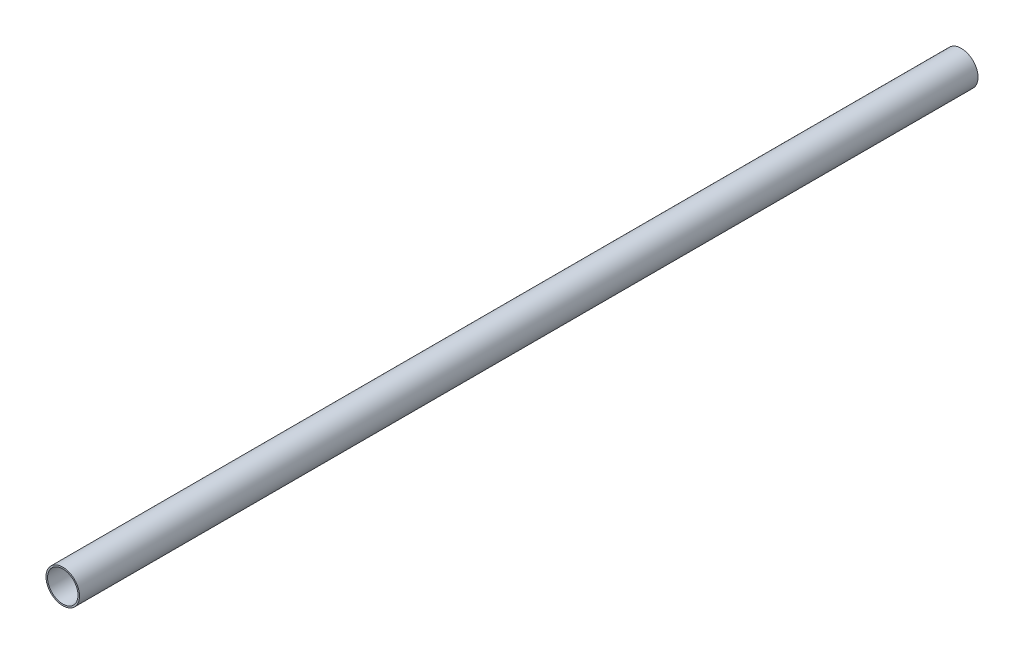
ISO-10303-21;
HEADER;
FILE_DESCRIPTION(('STEP AP214'),'2;1');
FILE_NAME('part.step','',(''),(''),'','','');
FILE_SCHEMA(('AUTOMOTIVE_DESIGN { 1 0 10303 214 1 1 1 1 }'));
ENDSEC;
DATA;
#1=APPLICATION_CONTEXT('core data for automotive mechanical design processes');
#2=APPLICATION_PROTOCOL_DEFINITION('international standard','automotive_design',2000,#1);
#3=PRODUCT_CONTEXT('',#1,'mechanical');
#4=PRODUCT('Part','Part','',(#3));
#5=PRODUCT_RELATED_PRODUCT_CATEGORY('part','',(#4));
#6=PRODUCT_DEFINITION_FORMATION('','',#4);
#7=PRODUCT_DEFINITION_CONTEXT('part definition',#1,'design');
#8=PRODUCT_DEFINITION('design','',#6,#7);
#9=PRODUCT_DEFINITION_SHAPE('','',#8);
#10=(LENGTH_UNIT() NAMED_UNIT(*) SI_UNIT(.MILLI.,.METRE.));
#11=(NAMED_UNIT(*) PLANE_ANGLE_UNIT() SI_UNIT($,.RADIAN.));
#12=(NAMED_UNIT(*) SI_UNIT($,.STERADIAN.) SOLID_ANGLE_UNIT());
#13=UNCERTAINTY_MEASURE_WITH_UNIT(LENGTH_MEASURE(1.E-05),#10,'distance_accuracy_value','');
#14=(GEOMETRIC_REPRESENTATION_CONTEXT(3) GLOBAL_UNCERTAINTY_ASSIGNED_CONTEXT((#13)) GLOBAL_UNIT_ASSIGNED_CONTEXT((#10,
#11,#12)) REPRESENTATION_CONTEXT('',''));
#15=CARTESIAN_POINT('',(0.,0.,0.));
#16=DIRECTION('',(0.,0.,1.));
#17=DIRECTION('',(1.,0.,0.));
#18=AXIS2_PLACEMENT_3D('',#15,#16,#17);
#19=CARTESIAN_POINT('',(0.,0.,1498.6));
#20=DIRECTION('',(0.,0.,1.));
#21=DIRECTION('',(1.,0.,0.));
#22=AXIS2_PLACEMENT_3D('',#19,#20,#21);
#23=PLANE('',#22);
#24=CARTESIAN_POINT('',(0.,0.,1498.6));
#25=DIRECTION('',(0.,0.,1.));
#26=DIRECTION('',(1.,0.,0.));
#27=AXIS2_PLACEMENT_3D('',#24,#25,#26);
#28=CIRCLE('',#27,27.94);
#29=CARTESIAN_POINT('',(-27.94,0.,1498.6));
#30=VERTEX_POINT('',#29);
#31=EDGE_CURVE('E10',#30,#30,#28,.T.);
#32=ORIENTED_EDGE('',*,*,#31,.T.);
#33=EDGE_LOOP('',(#32));
#34=FACE_BOUND('',#33,.T.);
#35=CARTESIAN_POINT('',(0.,0.,1498.6));
#36=DIRECTION('',(0.,0.,1.));
#37=DIRECTION('',(1.,0.,0.));
#38=AXIS2_PLACEMENT_3D('',#35,#36,#37);
#39=CIRCLE('',#38,25.4);
#40=CARTESIAN_POINT('',(-25.4,0.,1498.6));
#41=VERTEX_POINT('',#40);
#42=EDGE_CURVE('E43',#41,#41,#39,.T.);
#43=ORIENTED_EDGE('',*,*,#42,.F.);
#44=EDGE_LOOP('',(#43));
#45=FACE_BOUND('',#44,.T.);
#46=ADVANCED_FACE('F32',(#34,#45),#23,.T.);
#47=CARTESIAN_POINT('',(0.,0.,0.));
#48=DIRECTION('',(0.,0.,1.));
#49=DIRECTION('',(1.,0.,0.));
#50=AXIS2_PLACEMENT_3D('',#47,#48,#49);
#51=PLANE('',#50);
#52=CARTESIAN_POINT('',(0.,0.,0.));
#53=DIRECTION('',(0.,0.,1.));
#54=DIRECTION('',(1.,0.,0.));
#55=AXIS2_PLACEMENT_3D('',#52,#53,#54);
#56=CIRCLE('',#55,27.94);
#57=CARTESIAN_POINT('',(-27.94,0.,0.));
#58=VERTEX_POINT('',#57);
#59=EDGE_CURVE('E36',#58,#58,#56,.T.);
#60=ORIENTED_EDGE('',*,*,#59,.F.);
#61=EDGE_LOOP('',(#60));
#62=FACE_BOUND('',#61,.T.);
#63=CARTESIAN_POINT('',(0.,0.,0.));
#64=DIRECTION('',(0.,0.,1.));
#65=DIRECTION('',(1.,0.,0.));
#66=AXIS2_PLACEMENT_3D('',#63,#64,#65);
#67=CIRCLE('',#66,25.4);
#68=CARTESIAN_POINT('',(-25.4,0.,0.));
#69=VERTEX_POINT('',#68);
#70=EDGE_CURVE('E45',#69,#69,#67,.T.);
#71=ORIENTED_EDGE('',*,*,#70,.T.);
#72=EDGE_LOOP('',(#71));
#73=FACE_BOUND('',#72,.T.);
#74=ADVANCED_FACE('F55',(#62,#73),#51,.F.);
#75=CARTESIAN_POINT('',(0.,0.,1498.6));
#76=DIRECTION('',(0.,0.,-1.));
#77=DIRECTION('',(-1.,0.,0.));
#78=AXIS2_PLACEMENT_3D('',#75,#76,#77);
#79=CYLINDRICAL_SURFACE('',#78,27.94);
#80=CARTESIAN_POINT('',(-27.94,0.,1498.6));
#81=CARTESIAN_POINT('',(-27.94,0.,1482.98958333333));
#82=CARTESIAN_POINT('',(-27.94,0.,1467.37916666667));
#83=CARTESIAN_POINT('',(-27.94,0.,1436.15833333333));
#84=CARTESIAN_POINT('',(-27.94,0.,1420.54791666667));
#85=CARTESIAN_POINT('',(-27.94,0.,1389.32708333333));
#86=CARTESIAN_POINT('',(-27.94,0.,1373.71666666667));
#87=CARTESIAN_POINT('',(-27.94,0.,1342.49583333333));
#88=CARTESIAN_POINT('',(-27.94,0.,1326.88541666667));
#89=CARTESIAN_POINT('',(-27.94,0.,1295.66458333333));
#90=CARTESIAN_POINT('',(-27.94,0.,1280.05416666667));
#91=CARTESIAN_POINT('',(-27.94,0.,1248.83333333333));
#92=CARTESIAN_POINT('',(-27.94,0.,1233.22291666667));
#93=CARTESIAN_POINT('',(-27.94,0.,1202.00208333333));
#94=CARTESIAN_POINT('',(-27.94,0.,1186.39166666667));
#95=CARTESIAN_POINT('',(-27.94,0.,1155.17083333333));
#96=CARTESIAN_POINT('',(-27.94,0.,1139.56041666667));
#97=CARTESIAN_POINT('',(-27.94,0.,1108.33958333333));
#98=CARTESIAN_POINT('',(-27.94,0.,1092.72916666667));
#99=CARTESIAN_POINT('',(-27.94,0.,1061.50833333333));
#100=CARTESIAN_POINT('',(-27.94,0.,1045.89791666667));
#101=CARTESIAN_POINT('',(-27.94,0.,1014.67708333333));
#102=CARTESIAN_POINT('',(-27.94,0.,999.066666666666));
#103=CARTESIAN_POINT('',(-27.94,0.,967.845833333333));
#104=CARTESIAN_POINT('',(-27.94,0.,952.235416666667));
#105=CARTESIAN_POINT('',(-27.94,0.,921.014583333333));
#106=CARTESIAN_POINT('',(-27.94,0.,905.404166666666));
#107=CARTESIAN_POINT('',(-27.94,0.,874.183333333333));
#108=CARTESIAN_POINT('',(-27.94,0.,858.572916666667));
#109=CARTESIAN_POINT('',(-27.94,0.,827.352083333333));
#110=CARTESIAN_POINT('',(-27.94,0.,811.741666666666));
#111=CARTESIAN_POINT('',(-27.94,0.,780.520833333333));
#112=CARTESIAN_POINT('',(-27.94,0.,764.910416666666));
#113=CARTESIAN_POINT('',(-27.94,0.,733.689583333333));
#114=CARTESIAN_POINT('',(-27.94,0.,718.079166666667));
#115=CARTESIAN_POINT('',(-27.94,0.,686.858333333333));
#116=CARTESIAN_POINT('',(-27.94,0.,671.247916666666));
#117=CARTESIAN_POINT('',(-27.94,0.,640.027083333333));
#118=CARTESIAN_POINT('',(-27.94,0.,624.416666666667));
#119=CARTESIAN_POINT('',(-27.94,0.,593.195833333333));
#120=CARTESIAN_POINT('',(-27.94,0.,577.585416666667));
#121=CARTESIAN_POINT('',(-27.94,0.,546.364583333333));
#122=CARTESIAN_POINT('',(-27.94,0.,530.754166666666));
#123=CARTESIAN_POINT('',(-27.94,0.,499.533333333333));
#124=CARTESIAN_POINT('',(-27.94,0.,483.922916666667));
#125=CARTESIAN_POINT('',(-27.94,0.,452.702083333333));
#126=CARTESIAN_POINT('',(-27.94,0.,437.091666666667));
#127=CARTESIAN_POINT('',(-27.94,0.,405.870833333333));
#128=CARTESIAN_POINT('',(-27.94,0.,390.260416666667));
#129=CARTESIAN_POINT('',(-27.94,0.,359.039583333333));
#130=CARTESIAN_POINT('',(-27.94,0.,343.429166666667));
#131=CARTESIAN_POINT('',(-27.94,0.,312.208333333333));
#132=CARTESIAN_POINT('',(-27.94,0.,296.597916666667));
#133=CARTESIAN_POINT('',(-27.94,0.,265.377083333333));
#134=CARTESIAN_POINT('',(-27.94,0.,249.766666666667));
#135=CARTESIAN_POINT('',(-27.94,0.,218.545833333333));
#136=CARTESIAN_POINT('',(-27.94,0.,202.935416666667));
#137=CARTESIAN_POINT('',(-27.94,0.,171.714583333333));
#138=CARTESIAN_POINT('',(-27.94,0.,156.104166666667));
#139=CARTESIAN_POINT('',(-27.94,0.,124.883333333333));
#140=CARTESIAN_POINT('',(-27.94,0.,109.272916666667));
#141=CARTESIAN_POINT('',(-27.94,0.,78.0520833333334));
#142=CARTESIAN_POINT('',(-27.94,0.,62.4416666666667));
#143=CARTESIAN_POINT('',(-27.94,0.,31.2208333333334));
#144=CARTESIAN_POINT('',(-27.94,0.,15.6104166666667));
#145=CARTESIAN_POINT('',(-27.94,0.,0.));
#146=B_SPLINE_CURVE_WITH_KNOTS('',3,(#80,#81,#82,#83,#84,#85,#86,#87,#88,#89,#90,#91,#92,#93,
#94,#95,#96,#97,#98,#99,#100,#101,#102,#103,#104,#105,#106,#107,#108,#109,#110,#111,#112,#113,
#114,#115,#116,#117,#118,#119,#120,#121,#122,#123,#124,#125,#126,#127,#128,#129,#130,#131,#132,
#133,#134,#135,#136,#137,#138,#139,#140,#141,#142,#143,#144,#145),.UNSPECIFIED.,.F.,.F.,(4,2,2,
2,2,2,2,2,2,2,2,2,2,2,2,2,2,2,2,2,2,2,2,2,2,2,2,2,2,2,2,2,4),(0.,46.8312500000001,
93.6625000000002,140.49375,187.325,234.15625,280.9875,327.81875,374.65,421.48125,468.3125,
515.14375,561.975,608.80625,655.6375,702.46875,749.3,796.13125,842.9625,889.79375,936.625,
983.45625,1030.2875,1077.11875,1123.95,1170.78125,1217.6125,1264.44375,1311.275,1358.10625,
1404.9375,1451.76875,1498.6),.UNSPECIFIED.);
#147=EDGE_CURVE('BSEAM34',#30,#58,#146,.T.);
#148=ORIENTED_EDGE('',*,*,#31,.F.);
#149=ORIENTED_EDGE('',*,*,#59,.T.);
#150=ORIENTED_EDGE('',*,*,#147,.T.);
#151=ORIENTED_EDGE('',*,*,#147,.F.);
#152=EDGE_LOOP('',(#148,#150,#149,#151));
#153=FACE_BOUND('',#152,.T.);
#154=ADVANCED_FACE('F34',(#153),#79,.T.);
#155=CARTESIAN_POINT('',(0.,0.,1498.6));
#156=DIRECTION('',(0.,0.,-1.));
#157=DIRECTION('',(-1.,0.,0.));
#158=AXIS2_PLACEMENT_3D('',#155,#156,#157);
#159=CYLINDRICAL_SURFACE('',#158,25.4);
#160=CARTESIAN_POINT('',(-25.4,0.,1498.6));
#161=CARTESIAN_POINT('',(-25.4,0.,1482.98958333333));
#162=CARTESIAN_POINT('',(-25.4,0.,1467.37916666667));
#163=CARTESIAN_POINT('',(-25.4,0.,1436.15833333333));
#164=CARTESIAN_POINT('',(-25.4,0.,1420.54791666667));
#165=CARTESIAN_POINT('',(-25.4,0.,1389.32708333333));
#166=CARTESIAN_POINT('',(-25.4,0.,1373.71666666667));
#167=CARTESIAN_POINT('',(-25.4,0.,1342.49583333333));
#168=CARTESIAN_POINT('',(-25.4,0.,1326.88541666667));
#169=CARTESIAN_POINT('',(-25.4,0.,1295.66458333333));
#170=CARTESIAN_POINT('',(-25.4,0.,1280.05416666667));
#171=CARTESIAN_POINT('',(-25.4,0.,1248.83333333333));
#172=CARTESIAN_POINT('',(-25.4,0.,1233.22291666667));
#173=CARTESIAN_POINT('',(-25.4,0.,1202.00208333333));
#174=CARTESIAN_POINT('',(-25.4,0.,1186.39166666667));
#175=CARTESIAN_POINT('',(-25.4,0.,1155.17083333333));
#176=CARTESIAN_POINT('',(-25.4,0.,1139.56041666667));
#177=CARTESIAN_POINT('',(-25.4,0.,1108.33958333333));
#178=CARTESIAN_POINT('',(-25.4,0.,1092.72916666667));
#179=CARTESIAN_POINT('',(-25.4,0.,1061.50833333333));
#180=CARTESIAN_POINT('',(-25.4,0.,1045.89791666667));
#181=CARTESIAN_POINT('',(-25.4,0.,1014.67708333333));
#182=CARTESIAN_POINT('',(-25.4,0.,999.066666666667));
#183=CARTESIAN_POINT('',(-25.4,0.,967.845833333333));
#184=CARTESIAN_POINT('',(-25.4,0.,952.235416666667));
#185=CARTESIAN_POINT('',(-25.4,0.,921.014583333333));
#186=CARTESIAN_POINT('',(-25.4,0.,905.404166666667));
#187=CARTESIAN_POINT('',(-25.4,0.,874.183333333333));
#188=CARTESIAN_POINT('',(-25.4,0.,858.572916666667));
#189=CARTESIAN_POINT('',(-25.4,0.,827.352083333333));
#190=CARTESIAN_POINT('',(-25.4,0.,811.741666666667));
#191=CARTESIAN_POINT('',(-25.4,0.,780.520833333333));
#192=CARTESIAN_POINT('',(-25.4,0.,764.910416666667));
#193=CARTESIAN_POINT('',(-25.4,0.,733.689583333333));
#194=CARTESIAN_POINT('',(-25.4,0.,718.079166666667));
#195=CARTESIAN_POINT('',(-25.4,0.,686.858333333333));
#196=CARTESIAN_POINT('',(-25.4,0.,671.247916666667));
#197=CARTESIAN_POINT('',(-25.4,0.,640.027083333333));
#198=CARTESIAN_POINT('',(-25.4,0.,624.416666666667));
#199=CARTESIAN_POINT('',(-25.4,0.,593.195833333333));
#200=CARTESIAN_POINT('',(-25.4,0.,577.585416666667));
#201=CARTESIAN_POINT('',(-25.4,0.,546.364583333333));
#202=CARTESIAN_POINT('',(-25.4,0.,530.754166666667));
#203=CARTESIAN_POINT('',(-25.4,0.,499.533333333333));
#204=CARTESIAN_POINT('',(-25.4,0.,483.922916666667));
#205=CARTESIAN_POINT('',(-25.4,0.,452.702083333333));
#206=CARTESIAN_POINT('',(-25.4,0.,437.091666666667));
#207=CARTESIAN_POINT('',(-25.4,0.,405.870833333333));
#208=CARTESIAN_POINT('',(-25.4,0.,390.260416666667));
#209=CARTESIAN_POINT('',(-25.4,0.,359.039583333333));
#210=CARTESIAN_POINT('',(-25.4,0.,343.429166666667));
#211=CARTESIAN_POINT('',(-25.4,0.,312.208333333333));
#212=CARTESIAN_POINT('',(-25.4,0.,296.597916666667));
#213=CARTESIAN_POINT('',(-25.4,0.,265.377083333333));
#214=CARTESIAN_POINT('',(-25.4,0.,249.766666666667));
#215=CARTESIAN_POINT('',(-25.4,0.,218.545833333333));
#216=CARTESIAN_POINT('',(-25.4,0.,202.935416666667));
#217=CARTESIAN_POINT('',(-25.4,0.,171.714583333333));
#218=CARTESIAN_POINT('',(-25.4,0.,156.104166666667));
#219=CARTESIAN_POINT('',(-25.4,0.,124.883333333333));
#220=CARTESIAN_POINT('',(-25.4,0.,109.272916666667));
#221=CARTESIAN_POINT('',(-25.4,0.,78.0520833333334));
#222=CARTESIAN_POINT('',(-25.4,0.,62.4416666666667));
#223=CARTESIAN_POINT('',(-25.4,0.,31.2208333333334));
#224=CARTESIAN_POINT('',(-25.4,0.,15.6104166666667));
#225=CARTESIAN_POINT('',(-25.4,0.,0.));
#226=B_SPLINE_CURVE_WITH_KNOTS('',3,(#160,#161,#162,#163,#164,#165,#166,#167,#168,#169,#170,
#171,#172,#173,#174,#175,#176,#177,#178,#179,#180,#181,#182,#183,#184,#185,#186,#187,#188,#189,
#190,#191,#192,#193,#194,#195,#196,#197,#198,#199,#200,#201,#202,#203,#204,#205,#206,#207,#208,
#209,#210,#211,#212,#213,#214,#215,#216,#217,#218,#219,#220,#221,#222,#223,#224,#225),
.UNSPECIFIED.,.F.,.F.,(4,2,2,2,2,2,2,2,2,2,2,2,2,2,2,2,2,2,2,2,2,2,2,2,2,2,2,2,2,2,2,2,4),(0.,
46.8312499999999,93.6624999999998,140.49375,187.325,234.15625,280.9875,327.81875,374.65,
421.48125,468.3125,515.14375,561.975,608.80625,655.6375,702.46875,749.3,796.13125,842.9625,
889.79375,936.625,983.45625,1030.2875,1077.11875,1123.95,1170.78125,1217.6125,1264.44375,
1311.275,1358.10625,1404.9375,1451.76875,1498.6),.UNSPECIFIED.);
#227=EDGE_CURVE('BSEAM51',#41,#69,#226,.T.);
#228=ORIENTED_EDGE('',*,*,#42,.T.);
#229=ORIENTED_EDGE('',*,*,#70,.F.);
#230=ORIENTED_EDGE('',*,*,#227,.T.);
#231=ORIENTED_EDGE('',*,*,#227,.F.);
#232=EDGE_LOOP('',(#228,#230,#229,#231));
#233=FACE_BOUND('',#232,.T.);
#234=ADVANCED_FACE('F51',(#233),#159,.F.);
#235=CLOSED_SHELL('',(#46,#74,#154,#234));
#236=MANIFOLD_SOLID_BREP('B2',#235);
#237=ADVANCED_BREP_SHAPE_REPRESENTATION('',(#18,#236),#14);
#238=SHAPE_DEFINITION_REPRESENTATION(#9,#237);
ENDSEC;
END-ISO-10303-21;
